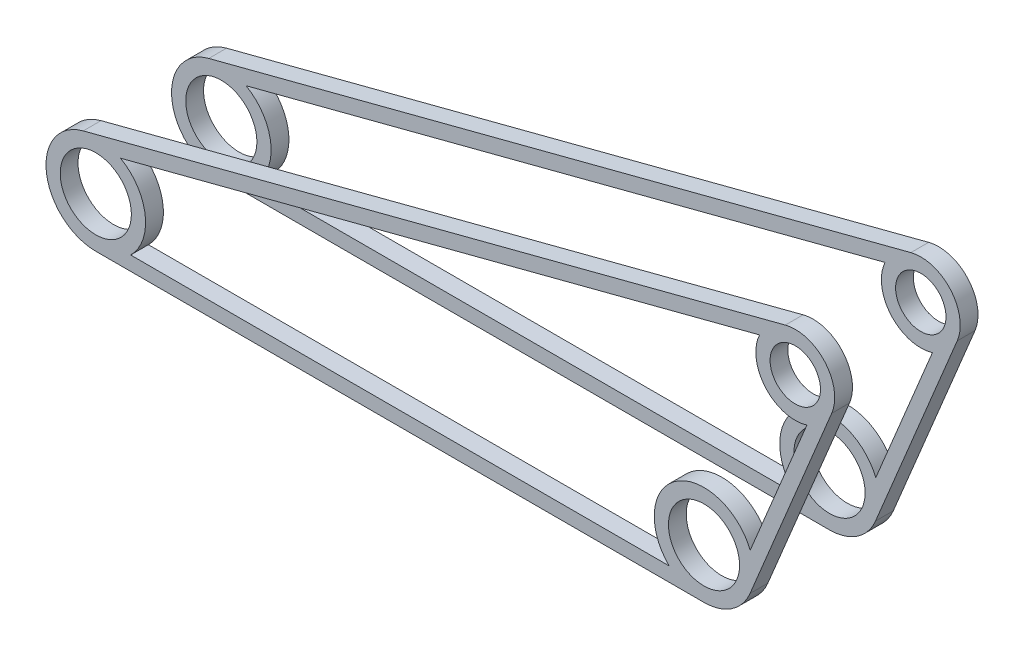
ISO-10303-21;
HEADER;
FILE_DESCRIPTION(('STEP AP214'),'2;1');
FILE_NAME('part.step','',(''),(''),'','','');
FILE_SCHEMA(('AUTOMOTIVE_DESIGN { 1 0 10303 214 1 1 1 1 }'));
ENDSEC;
DATA;
#1=APPLICATION_CONTEXT('core data for automotive mechanical design processes');
#2=APPLICATION_PROTOCOL_DEFINITION('international standard','automotive_design',2000,#1);
#3=PRODUCT_CONTEXT('',#1,'mechanical');
#4=PRODUCT('Part','Part','',(#3));
#5=PRODUCT_RELATED_PRODUCT_CATEGORY('part','',(#4));
#6=PRODUCT_DEFINITION_FORMATION('','',#4);
#7=PRODUCT_DEFINITION_CONTEXT('part definition',#1,'design');
#8=PRODUCT_DEFINITION('design','',#6,#7);
#9=PRODUCT_DEFINITION_SHAPE('','',#8);
#10=(LENGTH_UNIT() NAMED_UNIT(*) SI_UNIT(.MILLI.,.METRE.));
#11=(NAMED_UNIT(*) PLANE_ANGLE_UNIT() SI_UNIT($,.RADIAN.));
#12=(NAMED_UNIT(*) SI_UNIT($,.STERADIAN.) SOLID_ANGLE_UNIT());
#13=UNCERTAINTY_MEASURE_WITH_UNIT(LENGTH_MEASURE(1.E-05),#10,'distance_accuracy_value','');
#14=(GEOMETRIC_REPRESENTATION_CONTEXT(3) GLOBAL_UNCERTAINTY_ASSIGNED_CONTEXT((#13)) GLOBAL_UNIT_ASSIGNED_CONTEXT((#10,
#11,#12)) REPRESENTATION_CONTEXT('',''));
#15=CARTESIAN_POINT('',(0.,0.,0.));
#16=DIRECTION('',(0.,0.,1.));
#17=DIRECTION('',(1.,0.,0.));
#18=AXIS2_PLACEMENT_3D('',#15,#16,#17);
#19=CARTESIAN_POINT('',(108.585,0.,-12.79271));
#20=DIRECTION('',(0.,0.,1.));
#21=DIRECTION('',(1.,0.,0.));
#22=AXIS2_PLACEMENT_3D('',#19,#20,#21);
#23=CYLINDRICAL_SURFACE('',#22,8.88999999999992);
#24=CARTESIAN_POINT('',(108.585,0.,-9.61771));
#25=DIRECTION('',(0.,0.,1.));
#26=DIRECTION('',(1.,0.,0.));
#27=AXIS2_PLACEMENT_3D('',#24,#25,#26);
#28=CIRCLE('',#27,8.88999999999992);
#29=CARTESIAN_POINT('',(108.585,-8.88999999999996,-9.61771));
#30=VERTEX_POINT('',#29);
#31=CARTESIAN_POINT('',(116.796258377343,-3.40695404437924,-9.61771));
#32=VERTEX_POINT('',#31);
#33=EDGE_CURVE('E220',#30,#32,#28,.T.);
#34=ORIENTED_EDGE('',*,*,#33,.F.);
#35=DIRECTION('',(0.,0.,1.));
#36=VECTOR('',#35,1.);
#37=CARTESIAN_POINT('',(108.585,-8.88999999999996,-12.79271));
#38=LINE('',#37,#36);
#39=CARTESIAN_POINT('',(108.585,-8.88999999999996,-12.79271));
#40=VERTEX_POINT('',#39);
#41=EDGE_CURVE('E12',#40,#30,#38,.T.);
#42=ORIENTED_EDGE('',*,*,#41,.F.);
#43=CARTESIAN_POINT('',(108.585,0.,-12.79271));
#44=DIRECTION('',(0.,0.,1.));
#45=DIRECTION('',(1.,0.,0.));
#46=AXIS2_PLACEMENT_3D('',#43,#44,#45);
#47=CIRCLE('',#46,8.88999999999992);
#48=CARTESIAN_POINT('',(116.796258377343,-3.40695404437924,-12.79271));
#49=VERTEX_POINT('',#48);
#50=EDGE_CURVE('E342',#40,#49,#47,.T.);
#51=ORIENTED_EDGE('',*,*,#50,.T.);
#52=DIRECTION('',(0.,0.,1.));
#53=VECTOR('',#52,1.);
#54=CARTESIAN_POINT('',(116.796258377343,-3.40695404437924,-12.79271));
#55=LINE('',#54,#53);
#56=EDGE_CURVE('E252',#49,#32,#55,.T.);
#57=ORIENTED_EDGE('',*,*,#56,.T.);
#58=EDGE_LOOP('',(#34,#42,#51,#57));
#59=FACE_BOUND('',#58,.T.);
#60=ADVANCED_FACE('F57',(#59),#23,.T.);
#61=CARTESIAN_POINT('',(0.,-8.89,-12.79271));
#62=DIRECTION('',(0.,1.,0.));
#63=DIRECTION('',(0.,0.,1.));
#64=AXIS2_PLACEMENT_3D('',#61,#62,#63);
#65=PLANE('',#64);
#66=DIRECTION('',(-1.,0.,0.));
#67=VECTOR('',#66,1.);
#68=CARTESIAN_POINT('',(0.,-8.89,-9.61771));
#69=LINE('',#68,#67);
#70=CARTESIAN_POINT('',(0.,-8.89,-9.61771));
#71=VERTEX_POINT('',#70);
#72=EDGE_CURVE('E237',#30,#71,#69,.T.);
#73=ORIENTED_EDGE('',*,*,#72,.T.);
#74=DIRECTION('',(0.,0.,1.));
#75=VECTOR('',#74,1.);
#76=CARTESIAN_POINT('',(0.,-8.89,-12.79271));
#77=LINE('',#76,#75);
#78=CARTESIAN_POINT('',(0.,-8.89,-12.79271));
#79=VERTEX_POINT('',#78);
#80=EDGE_CURVE('E68',#79,#71,#77,.T.);
#81=ORIENTED_EDGE('',*,*,#80,.F.);
#82=DIRECTION('',(-1.,0.,0.));
#83=VECTOR('',#82,1.);
#84=CARTESIAN_POINT('',(0.,-8.89,-12.79271));
#85=LINE('',#84,#83);
#86=EDGE_CURVE('E177',#40,#79,#85,.T.);
#87=ORIENTED_EDGE('',*,*,#86,.F.);
#88=ORIENTED_EDGE('',*,*,#41,.T.);
#89=EDGE_LOOP('',(#73,#81,#87,#88));
#90=FACE_BOUND('',#89,.T.);
#91=ADVANCED_FACE('F296',(#90),#65,.F.);
#92=CARTESIAN_POINT('',(0.,0.,-12.79271));
#93=DIRECTION('',(0.,0.,1.));
#94=DIRECTION('',(1.,0.,0.));
#95=AXIS2_PLACEMENT_3D('',#92,#93,#94);
#96=CYLINDRICAL_SURFACE('',#95,8.89);
#97=CARTESIAN_POINT('',(0.,0.,-9.61771));
#98=DIRECTION('',(0.,0.,1.));
#99=DIRECTION('',(1.,0.,0.));
#100=AXIS2_PLACEMENT_3D('',#97,#98,#99);
#101=CIRCLE('',#100,8.89);
#102=CARTESIAN_POINT('',(-2.24093910567499,8.60292345221417,-9.61771));
#103=VERTEX_POINT('',#102);
#104=EDGE_CURVE('E158',#103,#71,#101,.T.);
#105=ORIENTED_EDGE('',*,*,#104,.F.);
#106=DIRECTION('',(0.,0.,1.));
#107=VECTOR('',#106,1.);
#108=CARTESIAN_POINT('',(-2.24093910567499,8.60292345221417,-12.79271));
#109=LINE('',#108,#107);
#110=CARTESIAN_POINT('',(-2.24093910567499,8.60292345221417,-12.79271));
#111=VERTEX_POINT('',#110);
#112=EDGE_CURVE('E152',#111,#103,#109,.T.);
#113=ORIENTED_EDGE('',*,*,#112,.F.);
#114=CARTESIAN_POINT('',(0.,0.,-12.79271));
#115=DIRECTION('',(0.,0.,1.));
#116=DIRECTION('',(1.,0.,0.));
#117=AXIS2_PLACEMENT_3D('',#114,#115,#116);
#118=CIRCLE('',#117,8.89);
#119=EDGE_CURVE('E156',#111,#79,#118,.T.);
#120=ORIENTED_EDGE('',*,*,#119,.T.);
#121=ORIENTED_EDGE('',*,*,#80,.T.);
#122=EDGE_LOOP('',(#105,#113,#120,#121));
#123=FACE_BOUND('',#122,.T.);
#124=ADVANCED_FACE('F154',(#123),#96,.T.);
#125=CARTESIAN_POINT('',(-2.24093910567499,8.60292345221417,-12.79271));
#126=DIRECTION('',(0.252074140120921,-0.967707924883484,0.));
#127=DIRECTION('',(0.967707924883484,0.252074140120921,0.));
#128=AXIS2_PLACEMENT_3D('',#125,#126,#127);
#129=PLANE('',#128);
#130=DIRECTION('',(0.967707924883484,0.252074140120921,0.));
#131=VECTOR('',#130,1.);
#132=CARTESIAN_POINT('',(-2.24093910567499,8.60292345221417,-9.61771));
#133=LINE('',#132,#131);
#134=CARTESIAN_POINT('',(123.103161211443,41.253277442518,-9.61771));
#135=VERTEX_POINT('',#134);
#136=EDGE_CURVE('E232',#103,#135,#133,.T.);
#137=ORIENTED_EDGE('',*,*,#136,.T.);
#138=DIRECTION('',(0.,0.,1.));
#139=VECTOR('',#138,1.);
#140=CARTESIAN_POINT('',(123.103161211443,41.253277442518,-12.79271));
#141=LINE('',#140,#139);
#142=CARTESIAN_POINT('',(123.103161211443,41.253277442518,-12.79271));
#143=VERTEX_POINT('',#142);
#144=EDGE_CURVE('E163',#143,#135,#141,.T.);
#145=ORIENTED_EDGE('',*,*,#144,.F.);
#146=DIRECTION('',(0.967707924883484,0.252074140120921,0.));
#147=VECTOR('',#146,1.);
#148=CARTESIAN_POINT('',(-2.24093910567499,8.60292345221417,-12.79271));
#149=LINE('',#148,#147);
#150=EDGE_CURVE('E166',#111,#143,#149,.T.);
#151=ORIENTED_EDGE('',*,*,#150,.F.);
#152=ORIENTED_EDGE('',*,*,#112,.T.);
#153=EDGE_LOOP('',(#137,#145,#151,#152));
#154=FACE_BOUND('',#153,.T.);
#155=ADVANCED_FACE('F167',(#154),#129,.F.);
#156=CARTESIAN_POINT('',(124.877763157895,34.4406136513383,-12.79271));
#157=DIRECTION('',(0.,0.,1.));
#158=DIRECTION('',(1.,0.,0.));
#159=AXIS2_PLACEMENT_3D('',#156,#157,#158);
#160=CYLINDRICAL_SURFACE('',#159,7.04000000000003);
#161=CARTESIAN_POINT('',(124.877763157895,34.4406136513383,-9.61771));
#162=DIRECTION('',(0.,0.,1.));
#163=DIRECTION('',(1.,0.,0.));
#164=AXIS2_PLACEMENT_3D('',#161,#162,#163);
#165=CIRCLE('',#164,7.04000000000003);
#166=CARTESIAN_POINT('',(131.380266979773,31.7426432944845,-9.61771));
#167=VERTEX_POINT('',#166);
#168=EDGE_CURVE('E228',#167,#135,#165,.T.);
#169=ORIENTED_EDGE('',*,*,#168,.F.);
#170=DIRECTION('',(0.,0.,1.));
#171=VECTOR('',#170,1.);
#172=CARTESIAN_POINT('',(131.380266979773,31.7426432944845,-12.79271));
#173=LINE('',#172,#171);
#174=CARTESIAN_POINT('',(131.380266979773,31.7426432944845,-12.79271));
#175=VERTEX_POINT('',#174);
#176=EDGE_CURVE('E249',#175,#167,#173,.T.);
#177=ORIENTED_EDGE('',*,*,#176,.F.);
#178=CARTESIAN_POINT('',(124.877763157895,34.4406136513383,-12.79271));
#179=DIRECTION('',(0.,0.,1.));
#180=DIRECTION('',(1.,0.,0.));
#181=AXIS2_PLACEMENT_3D('',#178,#179,#180);
#182=CIRCLE('',#181,7.04000000000003);
#183=EDGE_CURVE('E172',#175,#143,#182,.T.);
#184=ORIENTED_EDGE('',*,*,#183,.T.);
#185=ORIENTED_EDGE('',*,*,#144,.T.);
#186=EDGE_LOOP('',(#169,#177,#184,#185));
#187=FACE_BOUND('',#186,.T.);
#188=ADVANCED_FACE('F354',(#187),#160,.T.);
#189=CARTESIAN_POINT('',(98.5024549059795,-40.8699034546516,-12.79271));
#190=DIRECTION('',(0.923651111062219,-0.383234425689456,0.));
#191=DIRECTION('',(0.383234425689456,0.923651111062219,0.));
#192=AXIS2_PLACEMENT_3D('',#189,#190,#191);
#193=PLANE('',#192);
#194=DIRECTION('',(0.383234425689456,0.923651111062219,0.));
#195=VECTOR('',#194,1.);
#196=CARTESIAN_POINT('',(98.5024549059795,-40.8699034546516,-9.61771));
#197=LINE('',#196,#195);
#198=CARTESIAN_POINT('',(116.834555694057,3.31314515991316,-9.61771));
#199=VERTEX_POINT('',#198);
#200=CARTESIAN_POINT('',(126.959354756851,27.7153942188472,-9.61771));
#201=VERTEX_POINT('',#200);
#202=EDGE_CURVE('E192',#199,#201,#197,.T.);
#203=ORIENTED_EDGE('',*,*,#202,.T.);
#204=DIRECTION('',(0.,0.,1.));
#205=VECTOR('',#204,1.);
#206=CARTESIAN_POINT('',(126.959354756851,27.7153942188472,-12.79271));
#207=LINE('',#206,#205);
#208=CARTESIAN_POINT('',(126.959354756851,27.7153942188472,-12.79271));
#209=VERTEX_POINT('',#208);
#210=EDGE_CURVE('E255',#209,#201,#207,.T.);
#211=ORIENTED_EDGE('',*,*,#210,.F.);
#212=DIRECTION('',(0.383234425689456,0.923651111062219,0.));
#213=VECTOR('',#212,1.);
#214=CARTESIAN_POINT('',(98.5024549059795,-40.8699034546516,-12.79271));
#215=LINE('',#214,#213);
#216=CARTESIAN_POINT('',(116.834555694057,3.31314515991316,-12.79271));
#217=VERTEX_POINT('',#216);
#218=EDGE_CURVE('E274',#217,#209,#215,.T.);
#219=ORIENTED_EDGE('',*,*,#218,.F.);
#220=DIRECTION('',(0.,0.,1.));
#221=VECTOR('',#220,1.);
#222=CARTESIAN_POINT('',(116.834555694057,3.31314515991316,-12.79271));
#223=LINE('',#222,#221);
#224=EDGE_CURVE('E61',#217,#199,#223,.T.);
#225=ORIENTED_EDGE('',*,*,#224,.T.);
#226=EDGE_LOOP('',(#203,#211,#219,#225));
#227=FACE_BOUND('',#226,.T.);
#228=ADVANCED_FACE('F272',(#227),#193,.F.);
#229=CARTESIAN_POINT('',(124.877763157895,34.4406136513383,-12.79271));
#230=DIRECTION('',(0.,0.,1.));
#231=DIRECTION('',(1.,0.,0.));
#232=AXIS2_PLACEMENT_3D('',#229,#230,#231);
#233=CYLINDRICAL_SURFACE('',#232,7.04000000000003);
#234=CARTESIAN_POINT('',(124.877763157895,34.4406136513383,-9.61771));
#235=DIRECTION('',(0.,0.,1.));
#236=DIRECTION('',(1.,0.,0.));
#237=AXIS2_PLACEMENT_3D('',#234,#235,#236);
#238=CIRCLE('',#237,7.04000000000003);
#239=CARTESIAN_POINT('',(118.504240590403,37.4305651696196,-9.61771));
#240=VERTEX_POINT('',#239);
#241=EDGE_CURVE('E212',#240,#201,#238,.T.);
#242=ORIENTED_EDGE('',*,*,#241,.F.);
#243=DIRECTION('',(0.,0.,1.));
#244=VECTOR('',#243,1.);
#245=CARTESIAN_POINT('',(118.504240590403,37.4305651696196,-12.79271));
#246=LINE('',#245,#244);
#247=CARTESIAN_POINT('',(118.504240590403,37.4305651696196,-12.79271));
#248=VERTEX_POINT('',#247);
#249=EDGE_CURVE('E258',#248,#240,#246,.T.);
#250=ORIENTED_EDGE('',*,*,#249,.F.);
#251=CARTESIAN_POINT('',(124.877763157895,34.4406136513383,-12.79271));
#252=DIRECTION('',(0.,0.,1.));
#253=DIRECTION('',(1.,0.,0.));
#254=AXIS2_PLACEMENT_3D('',#251,#252,#253);
#255=CIRCLE('',#254,7.04000000000003);
#256=EDGE_CURVE('E333',#248,#209,#255,.T.);
#257=ORIENTED_EDGE('',*,*,#256,.T.);
#258=ORIENTED_EDGE('',*,*,#210,.T.);
#259=EDGE_LOOP('',(#242,#250,#257,#258));
#260=FACE_BOUND('',#259,.T.);
#261=ADVANCED_FACE('F305',(#260),#233,.T.);
#262=CARTESIAN_POINT('',(-1.60067078976785,6.14494532301012,-12.79271));
#263=DIRECTION('',(0.252074140120921,-0.967707924883484,0.));
#264=DIRECTION('',(0.967707924883484,0.252074140120921,0.));
#265=AXIS2_PLACEMENT_3D('',#262,#263,#264);
#266=PLANE('',#265);
#267=DIRECTION('',(0.967707924883484,0.252074140120921,0.));
#268=VECTOR('',#267,1.);
#269=CARTESIAN_POINT('',(-1.60067078976785,6.14494532301012,-9.61771));
#270=LINE('',#269,#268);
#271=CARTESIAN_POINT('',(4.42012142570285,7.71327599545372,-9.61771));
#272=VERTEX_POINT('',#271);
#273=EDGE_CURVE('E208',#272,#240,#270,.T.);
#274=ORIENTED_EDGE('',*,*,#273,.F.);
#275=DIRECTION('',(0.,0.,1.));
#276=VECTOR('',#275,1.);
#277=CARTESIAN_POINT('',(4.42012142570285,7.71327599545372,-12.79271));
#278=LINE('',#277,#276);
#279=CARTESIAN_POINT('',(4.42012142570285,7.71327599545372,-12.79271));
#280=VERTEX_POINT('',#279);
#281=EDGE_CURVE('E261',#280,#272,#278,.T.);
#282=ORIENTED_EDGE('',*,*,#281,.F.);
#283=DIRECTION('',(0.967707924883484,0.252074140120921,0.));
#284=VECTOR('',#283,1.);
#285=CARTESIAN_POINT('',(-1.60067078976785,6.14494532301012,-12.79271));
#286=LINE('',#285,#284);
#287=EDGE_CURVE('E337',#280,#248,#286,.T.);
#288=ORIENTED_EDGE('',*,*,#287,.T.);
#289=ORIENTED_EDGE('',*,*,#249,.T.);
#290=EDGE_LOOP('',(#274,#282,#288,#289));
#291=FACE_BOUND('',#290,.T.);
#292=ADVANCED_FACE('F308',(#291),#266,.T.);
#293=CARTESIAN_POINT('',(0.,0.,-12.79271));
#294=DIRECTION('',(0.,0.,1.));
#295=DIRECTION('',(1.,0.,0.));
#296=AXIS2_PLACEMENT_3D('',#293,#294,#295);
#297=CYLINDRICAL_SURFACE('',#296,8.89);
#298=CARTESIAN_POINT('',(0.,0.,-9.61771));
#299=DIRECTION('',(0.,0.,1.));
#300=DIRECTION('',(1.,0.,0.));
#301=AXIS2_PLACEMENT_3D('',#298,#299,#300);
#302=CIRCLE('',#301,8.89);
#303=CARTESIAN_POINT('',(6.22170394666927,-6.35,-9.61771));
#304=VERTEX_POINT('',#303);
#305=EDGE_CURVE('E204',#304,#272,#302,.T.);
#306=ORIENTED_EDGE('',*,*,#305,.F.);
#307=DIRECTION('',(0.,0.,1.));
#308=VECTOR('',#307,1.);
#309=CARTESIAN_POINT('',(6.22170394666927,-6.35,-12.79271));
#310=LINE('',#309,#308);
#311=CARTESIAN_POINT('',(6.22170394666927,-6.35,-12.79271));
#312=VERTEX_POINT('',#311);
#313=EDGE_CURVE('E264',#312,#304,#310,.T.);
#314=ORIENTED_EDGE('',*,*,#313,.F.);
#315=CARTESIAN_POINT('',(0.,0.,-12.79271));
#316=DIRECTION('',(0.,0.,1.));
#317=DIRECTION('',(1.,0.,0.));
#318=AXIS2_PLACEMENT_3D('',#315,#316,#317);
#319=CIRCLE('',#318,8.89);
#320=EDGE_CURVE('E328',#312,#280,#319,.T.);
#321=ORIENTED_EDGE('',*,*,#320,.T.);
#322=ORIENTED_EDGE('',*,*,#281,.T.);
#323=EDGE_LOOP('',(#306,#314,#321,#322));
#324=FACE_BOUND('',#323,.T.);
#325=ADVANCED_FACE('F312',(#324),#297,.T.);
#326=CARTESIAN_POINT('',(0.,-6.35,-12.79271));
#327=DIRECTION('',(0.,-1.,0.));
#328=DIRECTION('',(1.,0.,0.));
#329=AXIS2_PLACEMENT_3D('',#326,#327,#328);
#330=PLANE('',#329);
#331=DIRECTION('',(1.,0.,0.));
#332=VECTOR('',#331,1.);
#333=CARTESIAN_POINT('',(0.,-6.35,-9.61771));
#334=LINE('',#333,#332);
#335=CARTESIAN_POINT('',(102.363296053331,-6.35,-9.61771));
#336=VERTEX_POINT('',#335);
#337=EDGE_CURVE('E200',#304,#336,#334,.T.);
#338=ORIENTED_EDGE('',*,*,#337,.T.);
#339=DIRECTION('',(0.,0.,1.));
#340=VECTOR('',#339,1.);
#341=CARTESIAN_POINT('',(102.363296053331,-6.35,-12.79271));
#342=LINE('',#341,#340);
#343=CARTESIAN_POINT('',(102.363296053331,-6.35,-12.79271));
#344=VERTEX_POINT('',#343);
#345=EDGE_CURVE('E266',#344,#336,#342,.T.);
#346=ORIENTED_EDGE('',*,*,#345,.F.);
#347=DIRECTION('',(1.,0.,0.));
#348=VECTOR('',#347,1.);
#349=CARTESIAN_POINT('',(0.,-6.35,-12.79271));
#350=LINE('',#349,#348);
#351=EDGE_CURVE('E533',#312,#344,#350,.T.);
#352=ORIENTED_EDGE('',*,*,#351,.F.);
#353=ORIENTED_EDGE('',*,*,#313,.T.);
#354=EDGE_LOOP('',(#338,#346,#352,#353));
#355=FACE_BOUND('',#354,.T.);
#356=ADVANCED_FACE('F315',(#355),#330,.F.);
#357=CARTESIAN_POINT('',(100.848528728078,-41.8433188959028,-12.79271));
#358=DIRECTION('',(-0.92365111106222,0.383234425689455,0.));
#359=DIRECTION('',(-0.383234425689455,-0.92365111106222,0.));
#360=AXIS2_PLACEMENT_3D('',#357,#358,#359);
#361=PLANE('',#360);
#362=DIRECTION('',(-0.383234425689455,-0.92365111106222,0.));
#363=VECTOR('',#362,1.);
#364=CARTESIAN_POINT('',(100.848528728078,-41.8433188959028,-9.61771));
#365=LINE('',#364,#363);
#366=EDGE_CURVE('E224',#167,#32,#365,.T.);
#367=ORIENTED_EDGE('',*,*,#366,.T.);
#368=ORIENTED_EDGE('',*,*,#56,.F.);
#369=DIRECTION('',(-0.383234425689455,-0.92365111106222,0.));
#370=VECTOR('',#369,1.);
#371=CARTESIAN_POINT('',(100.848528728078,-41.8433188959028,-12.79271));
#372=LINE('',#371,#370);
#373=EDGE_CURVE('E349',#175,#49,#372,.T.);
#374=ORIENTED_EDGE('',*,*,#373,.F.);
#375=ORIENTED_EDGE('',*,*,#176,.T.);
#376=EDGE_LOOP('',(#367,#368,#374,#375));
#377=FACE_BOUND('',#376,.T.);
#378=ADVANCED_FACE('F291',(#377),#361,.F.);
#379=CARTESIAN_POINT('',(124.877763157895,34.4406136513383,-12.79271));
#380=DIRECTION('',(0.,0.,1.));
#381=DIRECTION('',(1.,0.,0.));
#382=AXIS2_PLACEMENT_3D('',#379,#380,#381);
#383=CYLINDRICAL_SURFACE('',#382,4.50000000000002);
#384=CARTESIAN_POINT('',(124.877763157895,34.4406136513383,-12.79271));
#385=DIRECTION('',(0.,0.,1.));
#386=DIRECTION('',(1.,0.,0.));
#387=AXIS2_PLACEMENT_3D('',#384,#385,#386);
#388=CIRCLE('',#387,4.50000000000002);
#389=CARTESIAN_POINT('',(129.377763157895,34.4406136513383,-12.79271));
#390=VERTEX_POINT('',#389);
#391=EDGE_CURVE('E336',#390,#390,#388,.T.);
#392=ORIENTED_EDGE('',*,*,#391,.F.);
#393=EDGE_LOOP('',(#392));
#394=FACE_BOUND('',#393,.T.);
#395=CARTESIAN_POINT('',(124.877763157895,34.4406136513383,-9.61771));
#396=DIRECTION('',(0.,0.,1.));
#397=DIRECTION('',(1.,0.,0.));
#398=AXIS2_PLACEMENT_3D('',#395,#396,#397);
#399=CIRCLE('',#398,4.50000000000002);
#400=CARTESIAN_POINT('',(129.377763157895,34.4406136513383,-9.61771));
#401=VERTEX_POINT('',#400);
#402=EDGE_CURVE('E216',#401,#401,#399,.T.);
#403=ORIENTED_EDGE('',*,*,#402,.T.);
#404=EDGE_LOOP('',(#403));
#405=FACE_BOUND('',#404,.T.);
#406=ADVANCED_FACE('F283',(#394,#405),#383,.F.);
#407=CARTESIAN_POINT('',(108.585,0.,-12.79271));
#408=DIRECTION('',(0.,0.,1.));
#409=DIRECTION('',(1.,0.,0.));
#410=AXIS2_PLACEMENT_3D('',#407,#408,#409);
#411=CYLINDRICAL_SURFACE('',#410,8.88999999999992);
#412=CARTESIAN_POINT('',(108.585,0.,-9.61771));
#413=DIRECTION('',(0.,0.,1.));
#414=DIRECTION('',(1.,0.,0.));
#415=AXIS2_PLACEMENT_3D('',#412,#413,#414);
#416=CIRCLE('',#415,8.88999999999992);
#417=EDGE_CURVE('E196',#199,#336,#416,.T.);
#418=ORIENTED_EDGE('',*,*,#417,.F.);
#419=ORIENTED_EDGE('',*,*,#224,.F.);
#420=CARTESIAN_POINT('',(108.585,0.,-12.79271));
#421=DIRECTION('',(0.,0.,1.));
#422=DIRECTION('',(1.,0.,0.));
#423=AXIS2_PLACEMENT_3D('',#420,#421,#422);
#424=CIRCLE('',#423,8.88999999999992);
#425=EDGE_CURVE('E528',#217,#344,#424,.T.);
#426=ORIENTED_EDGE('',*,*,#425,.T.);
#427=ORIENTED_EDGE('',*,*,#345,.T.);
#428=EDGE_LOOP('',(#418,#419,#426,#427));
#429=FACE_BOUND('',#428,.T.);
#430=ADVANCED_FACE('F281',(#429),#411,.T.);
#431=CARTESIAN_POINT('',(108.585,0.,-12.79271));
#432=DIRECTION('',(0.,0.,1.));
#433=DIRECTION('',(1.,0.,0.));
#434=AXIS2_PLACEMENT_3D('',#431,#432,#433);
#435=CYLINDRICAL_SURFACE('',#434,6.35000000000007);
#436=CARTESIAN_POINT('',(108.585,0.,-12.79271));
#437=DIRECTION('',(0.,0.,1.));
#438=DIRECTION('',(1.,0.,0.));
#439=AXIS2_PLACEMENT_3D('',#436,#437,#438);
#440=CIRCLE('',#439,6.35000000000007);
#441=CARTESIAN_POINT('',(114.935,0.,-12.79271));
#442=VERTEX_POINT('',#441);
#443=EDGE_CURVE('E243',#442,#442,#440,.T.);
#444=ORIENTED_EDGE('',*,*,#443,.F.);
#445=EDGE_LOOP('',(#444));
#446=FACE_BOUND('',#445,.T.);
#447=CARTESIAN_POINT('',(108.585,0.,-9.61771));
#448=DIRECTION('',(0.,0.,1.));
#449=DIRECTION('',(1.,0.,0.));
#450=AXIS2_PLACEMENT_3D('',#447,#448,#449);
#451=CIRCLE('',#450,6.35000000000007);
#452=CARTESIAN_POINT('',(114.935,0.,-9.61771));
#453=VERTEX_POINT('',#452);
#454=EDGE_CURVE('E188',#453,#453,#451,.T.);
#455=ORIENTED_EDGE('',*,*,#454,.T.);
#456=EDGE_LOOP('',(#455));
#457=FACE_BOUND('',#456,.T.);
#458=ADVANCED_FACE('F59',(#446,#457),#435,.F.);
#459=CARTESIAN_POINT('',(0.,0.,-12.79271));
#460=DIRECTION('',(0.,0.,1.));
#461=DIRECTION('',(1.,0.,0.));
#462=AXIS2_PLACEMENT_3D('',#459,#460,#461);
#463=CYLINDRICAL_SURFACE('',#462,6.35);
#464=CARTESIAN_POINT('',(0.,0.,-12.79271));
#465=DIRECTION('',(0.,0.,1.));
#466=DIRECTION('',(1.,0.,0.));
#467=AXIS2_PLACEMENT_3D('',#464,#465,#466);
#468=CIRCLE('',#467,6.35);
#469=CARTESIAN_POINT('',(6.35,0.,-12.79271));
#470=VERTEX_POINT('',#469);
#471=EDGE_CURVE('E181',#470,#470,#468,.T.);
#472=ORIENTED_EDGE('',*,*,#471,.F.);
#473=EDGE_LOOP('',(#472));
#474=FACE_BOUND('',#473,.T.);
#475=CARTESIAN_POINT('',(0.,0.,-9.61771));
#476=DIRECTION('',(0.,0.,1.));
#477=DIRECTION('',(1.,0.,0.));
#478=AXIS2_PLACEMENT_3D('',#475,#476,#477);
#479=CIRCLE('',#478,6.35);
#480=CARTESIAN_POINT('',(6.35,0.,-9.61771));
#481=VERTEX_POINT('',#480);
#482=EDGE_CURVE('E240',#481,#481,#479,.T.);
#483=ORIENTED_EDGE('',*,*,#482,.T.);
#484=EDGE_LOOP('',(#483));
#485=FACE_BOUND('',#484,.T.);
#486=ADVANCED_FACE('F289',(#474,#485),#463,.F.);
#487=CARTESIAN_POINT('',(0.,0.,-12.79271));
#488=DIRECTION('',(0.,0.,1.));
#489=DIRECTION('',(1.,0.,0.));
#490=AXIS2_PLACEMENT_3D('',#487,#488,#489);
#491=PLANE('',#490);
#492=ORIENTED_EDGE('',*,*,#443,.T.);
#493=EDGE_LOOP('',(#492));
#494=FACE_BOUND('',#493,.T.);
#495=ORIENTED_EDGE('',*,*,#218,.T.);
#496=ORIENTED_EDGE('',*,*,#256,.F.);
#497=ORIENTED_EDGE('',*,*,#287,.F.);
#498=ORIENTED_EDGE('',*,*,#320,.F.);
#499=ORIENTED_EDGE('',*,*,#351,.T.);
#500=ORIENTED_EDGE('',*,*,#425,.F.);
#501=EDGE_LOOP('',(#495,#496,#497,#498,#499,#500));
#502=FACE_BOUND('',#501,.T.);
#503=ORIENTED_EDGE('',*,*,#391,.T.);
#504=EDGE_LOOP('',(#503));
#505=FACE_BOUND('',#504,.T.);
#506=ORIENTED_EDGE('',*,*,#50,.F.);
#507=ORIENTED_EDGE('',*,*,#86,.T.);
#508=ORIENTED_EDGE('',*,*,#119,.F.);
#509=ORIENTED_EDGE('',*,*,#150,.T.);
#510=ORIENTED_EDGE('',*,*,#183,.F.);
#511=ORIENTED_EDGE('',*,*,#373,.T.);
#512=EDGE_LOOP('',(#506,#507,#508,#509,#510,#511));
#513=FACE_BOUND('',#512,.T.);
#514=ORIENTED_EDGE('',*,*,#471,.T.);
#515=EDGE_LOOP('',(#514));
#516=FACE_BOUND('',#515,.T.);
#517=ADVANCED_FACE('F175',(#494,#502,#505,#513,#516),#491,.F.);
#518=CARTESIAN_POINT('',(0.,0.,-9.61771));
#519=DIRECTION('',(0.,0.,1.));
#520=DIRECTION('',(1.,0.,0.));
#521=AXIS2_PLACEMENT_3D('',#518,#519,#520);
#522=PLANE('',#521);
#523=ORIENTED_EDGE('',*,*,#454,.F.);
#524=EDGE_LOOP('',(#523));
#525=FACE_BOUND('',#524,.T.);
#526=ORIENTED_EDGE('',*,*,#202,.F.);
#527=ORIENTED_EDGE('',*,*,#417,.T.);
#528=ORIENTED_EDGE('',*,*,#337,.F.);
#529=ORIENTED_EDGE('',*,*,#305,.T.);
#530=ORIENTED_EDGE('',*,*,#273,.T.);
#531=ORIENTED_EDGE('',*,*,#241,.T.);
#532=EDGE_LOOP('',(#526,#527,#528,#529,#530,#531));
#533=FACE_BOUND('',#532,.T.);
#534=ORIENTED_EDGE('',*,*,#402,.F.);
#535=EDGE_LOOP('',(#534));
#536=FACE_BOUND('',#535,.T.);
#537=ORIENTED_EDGE('',*,*,#33,.T.);
#538=ORIENTED_EDGE('',*,*,#366,.F.);
#539=ORIENTED_EDGE('',*,*,#168,.T.);
#540=ORIENTED_EDGE('',*,*,#136,.F.);
#541=ORIENTED_EDGE('',*,*,#104,.T.);
#542=ORIENTED_EDGE('',*,*,#72,.F.);
#543=EDGE_LOOP('',(#537,#538,#539,#540,#541,#542));
#544=FACE_BOUND('',#543,.T.);
#545=ORIENTED_EDGE('',*,*,#482,.F.);
#546=EDGE_LOOP('',(#545));
#547=FACE_BOUND('',#546,.T.);
#548=ADVANCED_FACE('F277',(#525,#533,#536,#544,#547),#522,.T.);
#549=CLOSED_SHELL('',(#60,#91,#124,#155,#188,#228,#261,#292,#325,#356,#378,#406,#430,#458,#486,
#517,#548));
#550=MANIFOLD_SOLID_BREP('B2',#549);
#551=CARTESIAN_POINT('',(108.585,0.,12.79271));
#552=DIRECTION('',(0.,0.,-1.));
#553=DIRECTION('',(-1.,0.,0.));
#554=AXIS2_PLACEMENT_3D('',#551,#552,#553);
#555=CYLINDRICAL_SURFACE('',#554,8.88999999999992);
#556=CARTESIAN_POINT('',(108.585,0.,9.61771));
#557=DIRECTION('',(0.,0.,1.));
#558=DIRECTION('',(1.,0.,0.));
#559=AXIS2_PLACEMENT_3D('',#556,#557,#558);
#560=CIRCLE('',#559,8.88999999999992);
#561=CARTESIAN_POINT('',(108.585,-8.88999999999996,9.61771));
#562=VERTEX_POINT('',#561);
#563=CARTESIAN_POINT('',(116.796258377343,-3.40695404437924,9.61771));
#564=VERTEX_POINT('',#563);
#565=EDGE_CURVE('E698',#562,#564,#560,.T.);
#566=ORIENTED_EDGE('',*,*,#565,.T.);
#567=DIRECTION('',(0.,0.,-1.));
#568=VECTOR('',#567,1.);
#569=CARTESIAN_POINT('',(116.796258377343,-3.40695404437924,12.79271));
#570=LINE('',#569,#568);
#571=CARTESIAN_POINT('',(116.796258377343,-3.40695404437924,12.79271));
#572=VERTEX_POINT('',#571);
#573=EDGE_CURVE('E55',#572,#564,#570,.T.);
#574=ORIENTED_EDGE('',*,*,#573,.F.);
#575=CARTESIAN_POINT('',(108.585,0.,12.79271));
#576=DIRECTION('',(0.,0.,1.));
#577=DIRECTION('',(1.,0.,0.));
#578=AXIS2_PLACEMENT_3D('',#575,#576,#577);
#579=CIRCLE('',#578,8.88999999999992);
#580=CARTESIAN_POINT('',(108.585,-8.88999999999996,12.79271));
#581=VERTEX_POINT('',#580);
#582=EDGE_CURVE('E773',#581,#572,#579,.T.);
#583=ORIENTED_EDGE('',*,*,#582,.F.);
#584=DIRECTION('',(0.,0.,-1.));
#585=VECTOR('',#584,1.);
#586=CARTESIAN_POINT('',(108.585,-8.88999999999996,12.79271));
#587=LINE('',#586,#585);
#588=EDGE_CURVE('E563',#581,#562,#587,.T.);
#589=ORIENTED_EDGE('',*,*,#588,.T.);
#590=EDGE_LOOP('',(#566,#574,#583,#589));
#591=FACE_BOUND('',#590,.T.);
#592=ADVANCED_FACE('F544',(#591),#555,.T.);
#593=CARTESIAN_POINT('',(100.848528728078,-41.8433188959028,12.79271));
#594=DIRECTION('',(0.92365111106222,-0.383234425689455,0.));
#595=DIRECTION('',(0.383234425689455,0.92365111106222,0.));
#596=AXIS2_PLACEMENT_3D('',#593,#594,#595);
#597=PLANE('',#596);
#598=DIRECTION('',(-0.383234425689455,-0.92365111106222,0.));
#599=VECTOR('',#598,1.);
#600=CARTESIAN_POINT('',(100.848528728078,-41.8433188959028,9.61771));
#601=LINE('',#600,#599);
#602=CARTESIAN_POINT('',(131.380266979773,31.7426432944845,9.61771));
#603=VERTEX_POINT('',#602);
#604=EDGE_CURVE('E700',#603,#564,#601,.T.);
#605=ORIENTED_EDGE('',*,*,#604,.F.);
#606=DIRECTION('',(0.,0.,-1.));
#607=VECTOR('',#606,1.);
#608=CARTESIAN_POINT('',(131.380266979773,31.7426432944845,12.79271));
#609=LINE('',#608,#607);
#610=CARTESIAN_POINT('',(131.380266979773,31.7426432944845,12.79271));
#611=VERTEX_POINT('',#610);
#612=EDGE_CURVE('E554',#611,#603,#609,.T.);
#613=ORIENTED_EDGE('',*,*,#612,.F.);
#614=DIRECTION('',(-0.383234425689455,-0.92365111106222,0.));
#615=VECTOR('',#614,1.);
#616=CARTESIAN_POINT('',(100.848528728078,-41.8433188959028,12.79271));
#617=LINE('',#616,#615);
#618=EDGE_CURVE('E665',#611,#572,#617,.T.);
#619=ORIENTED_EDGE('',*,*,#618,.T.);
#620=ORIENTED_EDGE('',*,*,#573,.T.);
#621=EDGE_LOOP('',(#605,#613,#619,#620));
#622=FACE_BOUND('',#621,.T.);
#623=ADVANCED_FACE('F777',(#622),#597,.T.);
#624=CARTESIAN_POINT('',(124.877763157895,34.4406136513383,12.79271));
#625=DIRECTION('',(0.,0.,-1.));
#626=DIRECTION('',(-1.,0.,0.));
#627=AXIS2_PLACEMENT_3D('',#624,#625,#626);
#628=CYLINDRICAL_SURFACE('',#627,7.04000000000003);
#629=CARTESIAN_POINT('',(124.877763157895,34.4406136513383,9.61771));
#630=DIRECTION('',(0.,0.,1.));
#631=DIRECTION('',(1.,0.,0.));
#632=AXIS2_PLACEMENT_3D('',#629,#630,#631);
#633=CIRCLE('',#632,7.04000000000003);
#634=CARTESIAN_POINT('',(123.103161211443,41.253277442518,9.61771));
#635=VERTEX_POINT('',#634);
#636=EDGE_CURVE('E703',#603,#635,#633,.T.);
#637=ORIENTED_EDGE('',*,*,#636,.T.);
#638=DIRECTION('',(0.,0.,-1.));
#639=VECTOR('',#638,1.);
#640=CARTESIAN_POINT('',(123.103161211443,41.253277442518,12.79271));
#641=LINE('',#640,#639);
#642=CARTESIAN_POINT('',(123.103161211443,41.253277442518,12.79271));
#643=VERTEX_POINT('',#642);
#644=EDGE_CURVE('E650',#643,#635,#641,.T.);
#645=ORIENTED_EDGE('',*,*,#644,.F.);
#646=CARTESIAN_POINT('',(124.877763157895,34.4406136513383,12.79271));
#647=DIRECTION('',(0.,0.,1.));
#648=DIRECTION('',(1.,0.,0.));
#649=AXIS2_PLACEMENT_3D('',#646,#647,#648);
#650=CIRCLE('',#649,7.04000000000003);
#651=EDGE_CURVE('E662',#611,#643,#650,.T.);
#652=ORIENTED_EDGE('',*,*,#651,.F.);
#653=ORIENTED_EDGE('',*,*,#612,.T.);
#654=EDGE_LOOP('',(#637,#645,#652,#653));
#655=FACE_BOUND('',#654,.T.);
#656=ADVANCED_FACE('F783',(#655),#628,.T.);
#657=CARTESIAN_POINT('',(-2.24093910567499,8.60292345221417,12.79271));
#658=DIRECTION('',(-0.252074140120921,0.967707924883484,0.));
#659=DIRECTION('',(-0.967707924883484,-0.252074140120921,0.));
#660=AXIS2_PLACEMENT_3D('',#657,#658,#659);
#661=PLANE('',#660);
#662=DIRECTION('',(0.967707924883484,0.252074140120921,0.));
#663=VECTOR('',#662,1.);
#664=CARTESIAN_POINT('',(-2.24093910567499,8.60292345221417,9.61771));
#665=LINE('',#664,#663);
#666=CARTESIAN_POINT('',(-2.24093910567499,8.60292345221417,9.61771));
#667=VERTEX_POINT('',#666);
#668=EDGE_CURVE('E647',#667,#635,#665,.T.);
#669=ORIENTED_EDGE('',*,*,#668,.F.);
#670=DIRECTION('',(0.,0.,-1.));
#671=VECTOR('',#670,1.);
#672=CARTESIAN_POINT('',(-2.24093910567499,8.60292345221417,12.79271));
#673=LINE('',#672,#671);
#674=CARTESIAN_POINT('',(-2.24093910567499,8.60292345221417,12.79271));
#675=VERTEX_POINT('',#674);
#676=EDGE_CURVE('E641',#675,#667,#673,.T.);
#677=ORIENTED_EDGE('',*,*,#676,.F.);
#678=DIRECTION('',(0.967707924883484,0.252074140120921,0.));
#679=VECTOR('',#678,1.);
#680=CARTESIAN_POINT('',(-2.24093910567499,8.60292345221417,12.79271));
#681=LINE('',#680,#679);
#682=EDGE_CURVE('E645',#675,#643,#681,.T.);
#683=ORIENTED_EDGE('',*,*,#682,.T.);
#684=ORIENTED_EDGE('',*,*,#644,.T.);
#685=EDGE_LOOP('',(#669,#677,#683,#684));
#686=FACE_BOUND('',#685,.T.);
#687=ADVANCED_FACE('F643',(#686),#661,.T.);
#688=CARTESIAN_POINT('',(0.,0.,12.79271));
#689=DIRECTION('',(0.,0.,-1.));
#690=DIRECTION('',(-1.,0.,0.));
#691=AXIS2_PLACEMENT_3D('',#688,#689,#690);
#692=CYLINDRICAL_SURFACE('',#691,8.89);
#693=CARTESIAN_POINT('',(0.,0.,9.61771));
#694=DIRECTION('',(0.,0.,1.));
#695=DIRECTION('',(1.,0.,0.));
#696=AXIS2_PLACEMENT_3D('',#693,#694,#695);
#697=CIRCLE('',#696,8.89);
#698=CARTESIAN_POINT('',(0.,-8.89,9.61771));
#699=VERTEX_POINT('',#698);
#700=EDGE_CURVE('E707',#667,#699,#697,.T.);
#701=ORIENTED_EDGE('',*,*,#700,.T.);
#702=DIRECTION('',(0.,0.,-1.));
#703=VECTOR('',#702,1.);
#704=CARTESIAN_POINT('',(0.,-8.89,12.79271));
#705=LINE('',#704,#703);
#706=CARTESIAN_POINT('',(0.,-8.89,12.79271));
#707=VERTEX_POINT('',#706);
#708=EDGE_CURVE('E601',#707,#699,#705,.T.);
#709=ORIENTED_EDGE('',*,*,#708,.F.);
#710=CARTESIAN_POINT('',(0.,0.,12.79271));
#711=DIRECTION('',(0.,0.,1.));
#712=DIRECTION('',(1.,0.,0.));
#713=AXIS2_PLACEMENT_3D('',#710,#711,#712);
#714=CIRCLE('',#713,8.89);
#715=EDGE_CURVE('E652',#675,#707,#714,.T.);
#716=ORIENTED_EDGE('',*,*,#715,.F.);
#717=ORIENTED_EDGE('',*,*,#676,.T.);
#718=EDGE_LOOP('',(#701,#709,#716,#717));
#719=FACE_BOUND('',#718,.T.);
#720=ADVANCED_FACE('F653',(#719),#692,.T.);
#721=CARTESIAN_POINT('',(98.5024549059795,-40.8699034546516,12.79271));
#722=DIRECTION('',(-0.923651111062219,0.383234425689456,0.));
#723=DIRECTION('',(-0.383234425689456,-0.923651111062219,0.));
#724=AXIS2_PLACEMENT_3D('',#721,#722,#723);
#725=PLANE('',#724);
#726=DIRECTION('',(0.383234425689456,0.923651111062219,0.));
#727=VECTOR('',#726,1.);
#728=CARTESIAN_POINT('',(98.5024549059795,-40.8699034546516,9.61771));
#729=LINE('',#728,#727);
#730=CARTESIAN_POINT('',(116.834555694057,3.31314515991316,9.61771));
#731=VERTEX_POINT('',#730);
#732=CARTESIAN_POINT('',(126.959354756851,27.7153942188472,9.61771));
#733=VERTEX_POINT('',#732);
#734=EDGE_CURVE('E677',#731,#733,#729,.T.);
#735=ORIENTED_EDGE('',*,*,#734,.F.);
#736=DIRECTION('',(0.,0.,-1.));
#737=VECTOR('',#736,1.);
#738=CARTESIAN_POINT('',(116.834555694057,3.31314515991316,12.79271));
#739=LINE('',#738,#737);
#740=CARTESIAN_POINT('',(116.834555694057,3.31314515991316,12.79271));
#741=VERTEX_POINT('',#740);
#742=EDGE_CURVE('E548',#741,#731,#739,.T.);
#743=ORIENTED_EDGE('',*,*,#742,.F.);
#744=DIRECTION('',(0.383234425689456,0.923651111062219,0.));
#745=VECTOR('',#744,1.);
#746=CARTESIAN_POINT('',(98.5024549059795,-40.8699034546516,12.79271));
#747=LINE('',#746,#745);
#748=CARTESIAN_POINT('',(126.959354756851,27.7153942188472,12.79271));
#749=VERTEX_POINT('',#748);
#750=EDGE_CURVE('E744',#741,#749,#747,.T.);
#751=ORIENTED_EDGE('',*,*,#750,.T.);
#752=DIRECTION('',(0.,0.,-1.));
#753=VECTOR('',#752,1.);
#754=CARTESIAN_POINT('',(126.959354756851,27.7153942188472,12.79271));
#755=LINE('',#754,#753);
#756=EDGE_CURVE('E673',#749,#733,#755,.T.);
#757=ORIENTED_EDGE('',*,*,#756,.T.);
#758=EDGE_LOOP('',(#735,#743,#751,#757));
#759=FACE_BOUND('',#758,.T.);
#760=ADVANCED_FACE('F742',(#759),#725,.T.);
#761=CARTESIAN_POINT('',(108.585,0.,12.79271));
#762=DIRECTION('',(0.,0.,-1.));
#763=DIRECTION('',(-1.,0.,0.));
#764=AXIS2_PLACEMENT_3D('',#761,#762,#763);
#765=CYLINDRICAL_SURFACE('',#764,8.88999999999992);
#766=CARTESIAN_POINT('',(108.585,0.,9.61771));
#767=DIRECTION('',(0.,0.,1.));
#768=DIRECTION('',(1.,0.,0.));
#769=AXIS2_PLACEMENT_3D('',#766,#767,#768);
#770=CIRCLE('',#769,8.88999999999992);
#771=CARTESIAN_POINT('',(102.363296053331,-6.35,9.61771));
#772=VERTEX_POINT('',#771);
#773=EDGE_CURVE('E680',#731,#772,#770,.T.);
#774=ORIENTED_EDGE('',*,*,#773,.T.);
#775=DIRECTION('',(0.,0.,-1.));
#776=VECTOR('',#775,1.);
#777=CARTESIAN_POINT('',(102.363296053331,-6.35,12.79271));
#778=LINE('',#777,#776);
#779=CARTESIAN_POINT('',(102.363296053331,-6.35,12.79271));
#780=VERTEX_POINT('',#779);
#781=EDGE_CURVE('E728',#780,#772,#778,.T.);
#782=ORIENTED_EDGE('',*,*,#781,.F.);
#783=CARTESIAN_POINT('',(108.585,0.,12.79271));
#784=DIRECTION('',(0.,0.,1.));
#785=DIRECTION('',(1.,0.,0.));
#786=AXIS2_PLACEMENT_3D('',#783,#784,#785);
#787=CIRCLE('',#786,8.88999999999992);
#788=EDGE_CURVE('E736',#741,#780,#787,.T.);
#789=ORIENTED_EDGE('',*,*,#788,.F.);
#790=ORIENTED_EDGE('',*,*,#742,.T.);
#791=EDGE_LOOP('',(#774,#782,#789,#790));
#792=FACE_BOUND('',#791,.T.);
#793=ADVANCED_FACE('F735',(#792),#765,.T.);
#794=CARTESIAN_POINT('',(0.,-6.35,12.79271));
#795=DIRECTION('',(0.,1.,0.));
#796=DIRECTION('',(-1.,0.,0.));
#797=AXIS2_PLACEMENT_3D('',#794,#795,#796);
#798=PLANE('',#797);
#799=DIRECTION('',(1.,0.,0.));
#800=VECTOR('',#799,1.);
#801=CARTESIAN_POINT('',(0.,-6.35,9.61771));
#802=LINE('',#801,#800);
#803=CARTESIAN_POINT('',(6.22170394666927,-6.35,9.61771));
#804=VERTEX_POINT('',#803);
#805=EDGE_CURVE('E683',#804,#772,#802,.T.);
#806=ORIENTED_EDGE('',*,*,#805,.F.);
#807=DIRECTION('',(0.,0.,-1.));
#808=VECTOR('',#807,1.);
#809=CARTESIAN_POINT('',(6.22170394666927,-6.35,12.79271));
#810=LINE('',#809,#808);
#811=CARTESIAN_POINT('',(6.22170394666927,-6.35,12.79271));
#812=VERTEX_POINT('',#811);
#813=EDGE_CURVE('E727',#812,#804,#810,.T.);
#814=ORIENTED_EDGE('',*,*,#813,.F.);
#815=DIRECTION('',(1.,0.,0.));
#816=VECTOR('',#815,1.);
#817=CARTESIAN_POINT('',(0.,-6.35,12.79271));
#818=LINE('',#817,#816);
#819=EDGE_CURVE('E760',#812,#780,#818,.T.);
#820=ORIENTED_EDGE('',*,*,#819,.T.);
#821=ORIENTED_EDGE('',*,*,#781,.T.);
#822=EDGE_LOOP('',(#806,#814,#820,#821));
#823=FACE_BOUND('',#822,.T.);
#824=ADVANCED_FACE('F759',(#823),#798,.T.);
#825=CARTESIAN_POINT('',(0.,0.,12.79271));
#826=DIRECTION('',(0.,0.,-1.));
#827=DIRECTION('',(-1.,0.,0.));
#828=AXIS2_PLACEMENT_3D('',#825,#826,#827);
#829=CYLINDRICAL_SURFACE('',#828,8.89);
#830=CARTESIAN_POINT('',(0.,0.,9.61771));
#831=DIRECTION('',(0.,0.,1.));
#832=DIRECTION('',(1.,0.,0.));
#833=AXIS2_PLACEMENT_3D('',#830,#831,#832);
#834=CIRCLE('',#833,8.89);
#835=CARTESIAN_POINT('',(4.42012142570285,7.71327599545372,9.61771));
#836=VERTEX_POINT('',#835);
#837=EDGE_CURVE('E686',#804,#836,#834,.T.);
#838=ORIENTED_EDGE('',*,*,#837,.T.);
#839=DIRECTION('',(0.,0.,-1.));
#840=VECTOR('',#839,1.);
#841=CARTESIAN_POINT('',(4.42012142570285,7.71327599545372,12.79271));
#842=LINE('',#841,#840);
#843=CARTESIAN_POINT('',(4.42012142570285,7.71327599545372,12.79271));
#844=VERTEX_POINT('',#843);
#845=EDGE_CURVE('E724',#844,#836,#842,.T.);
#846=ORIENTED_EDGE('',*,*,#845,.F.);
#847=CARTESIAN_POINT('',(0.,0.,12.79271));
#848=DIRECTION('',(0.,0.,1.));
#849=DIRECTION('',(1.,0.,0.));
#850=AXIS2_PLACEMENT_3D('',#847,#848,#849);
#851=CIRCLE('',#850,8.89);
#852=EDGE_CURVE('E757',#812,#844,#851,.T.);
#853=ORIENTED_EDGE('',*,*,#852,.F.);
#854=ORIENTED_EDGE('',*,*,#813,.T.);
#855=EDGE_LOOP('',(#838,#846,#853,#854));
#856=FACE_BOUND('',#855,.T.);
#857=ADVANCED_FACE('F756',(#856),#829,.T.);
#858=CARTESIAN_POINT('',(-1.60067078976785,6.14494532301012,12.79271));
#859=DIRECTION('',(-0.252074140120921,0.967707924883484,0.));
#860=DIRECTION('',(-0.967707924883484,-0.252074140120921,0.));
#861=AXIS2_PLACEMENT_3D('',#858,#859,#860);
#862=PLANE('',#861);
#863=DIRECTION('',(0.967707924883484,0.252074140120921,0.));
#864=VECTOR('',#863,1.);
#865=CARTESIAN_POINT('',(-1.60067078976785,6.14494532301012,9.61771));
#866=LINE('',#865,#864);
#867=CARTESIAN_POINT('',(118.504240590403,37.4305651696196,9.61771));
#868=VERTEX_POINT('',#867);
#869=EDGE_CURVE('E689',#836,#868,#866,.T.);
#870=ORIENTED_EDGE('',*,*,#869,.T.);
#871=DIRECTION('',(0.,0.,-1.));
#872=VECTOR('',#871,1.);
#873=CARTESIAN_POINT('',(118.504240590403,37.4305651696196,12.79271));
#874=LINE('',#873,#872);
#875=CARTESIAN_POINT('',(118.504240590403,37.4305651696196,12.79271));
#876=VERTEX_POINT('',#875);
#877=EDGE_CURVE('E721',#876,#868,#874,.T.);
#878=ORIENTED_EDGE('',*,*,#877,.F.);
#879=DIRECTION('',(0.967707924883484,0.252074140120921,0.));
#880=VECTOR('',#879,1.);
#881=CARTESIAN_POINT('',(-1.60067078976785,6.14494532301012,12.79271));
#882=LINE('',#881,#880);
#883=EDGE_CURVE('E752',#844,#876,#882,.T.);
#884=ORIENTED_EDGE('',*,*,#883,.F.);
#885=ORIENTED_EDGE('',*,*,#845,.T.);
#886=EDGE_LOOP('',(#870,#878,#884,#885));
#887=FACE_BOUND('',#886,.T.);
#888=ADVANCED_FACE('F750',(#887),#862,.F.);
#889=CARTESIAN_POINT('',(0.,-8.89,12.79271));
#890=DIRECTION('',(0.,-1.,0.));
#891=DIRECTION('',(0.,0.,-1.));
#892=AXIS2_PLACEMENT_3D('',#889,#890,#891);
#893=PLANE('',#892);
#894=DIRECTION('',(-1.,0.,0.));
#895=VECTOR('',#894,1.);
#896=CARTESIAN_POINT('',(0.,-8.89,9.61771));
#897=LINE('',#896,#895);
#898=EDGE_CURVE('E709',#562,#699,#897,.T.);
#899=ORIENTED_EDGE('',*,*,#898,.F.);
#900=ORIENTED_EDGE('',*,*,#588,.F.);
#901=DIRECTION('',(-1.,0.,0.));
#902=VECTOR('',#901,1.);
#903=CARTESIAN_POINT('',(0.,-8.89,12.79271));
#904=LINE('',#903,#902);
#905=EDGE_CURVE('E656',#581,#707,#904,.T.);
#906=ORIENTED_EDGE('',*,*,#905,.T.);
#907=ORIENTED_EDGE('',*,*,#708,.T.);
#908=EDGE_LOOP('',(#899,#900,#906,#907));
#909=FACE_BOUND('',#908,.T.);
#910=ADVANCED_FACE('F800',(#909),#893,.T.);
#911=CARTESIAN_POINT('',(124.877763157895,34.4406136513383,12.79271));
#912=DIRECTION('',(0.,0.,-1.));
#913=DIRECTION('',(-1.,0.,0.));
#914=AXIS2_PLACEMENT_3D('',#911,#912,#913);
#915=CYLINDRICAL_SURFACE('',#914,4.50000000000002);
#916=CARTESIAN_POINT('',(124.877763157895,34.4406136513383,12.79271));
#917=DIRECTION('',(0.,0.,1.));
#918=DIRECTION('',(1.,0.,0.));
#919=AXIS2_PLACEMENT_3D('',#916,#917,#918);
#920=CIRCLE('',#919,4.50000000000002);
#921=CARTESIAN_POINT('',(129.377763157895,34.4406136513383,12.79271));
#922=VERTEX_POINT('',#921);
#923=EDGE_CURVE('E770',#922,#922,#920,.T.);
#924=ORIENTED_EDGE('',*,*,#923,.T.);
#925=EDGE_LOOP('',(#924));
#926=FACE_BOUND('',#925,.T.);
#927=CARTESIAN_POINT('',(124.877763157895,34.4406136513383,9.61771));
#928=DIRECTION('',(0.,0.,1.));
#929=DIRECTION('',(1.,0.,0.));
#930=AXIS2_PLACEMENT_3D('',#927,#928,#929);
#931=CIRCLE('',#930,4.50000000000002);
#932=CARTESIAN_POINT('',(129.377763157895,34.4406136513383,9.61771));
#933=VERTEX_POINT('',#932);
#934=EDGE_CURVE('E695',#933,#933,#931,.T.);
#935=ORIENTED_EDGE('',*,*,#934,.F.);
#936=EDGE_LOOP('',(#935));
#937=FACE_BOUND('',#936,.T.);
#938=ADVANCED_FACE('F797',(#926,#937),#915,.F.);
#939=CARTESIAN_POINT('',(124.877763157895,34.4406136513383,12.79271));
#940=DIRECTION('',(0.,0.,-1.));
#941=DIRECTION('',(-1.,0.,0.));
#942=AXIS2_PLACEMENT_3D('',#939,#940,#941);
#943=CYLINDRICAL_SURFACE('',#942,7.04000000000003);
#944=CARTESIAN_POINT('',(124.877763157895,34.4406136513383,9.61771));
#945=DIRECTION('',(0.,0.,1.));
#946=DIRECTION('',(1.,0.,0.));
#947=AXIS2_PLACEMENT_3D('',#944,#945,#946);
#948=CIRCLE('',#947,7.04000000000003);
#949=EDGE_CURVE('E692',#868,#733,#948,.T.);
#950=ORIENTED_EDGE('',*,*,#949,.T.);
#951=ORIENTED_EDGE('',*,*,#756,.F.);
#952=CARTESIAN_POINT('',(124.877763157895,34.4406136513383,12.79271));
#953=DIRECTION('',(0.,0.,1.));
#954=DIRECTION('',(1.,0.,0.));
#955=AXIS2_PLACEMENT_3D('',#952,#953,#954);
#956=CIRCLE('',#955,7.04000000000003);
#957=EDGE_CURVE('E768',#876,#749,#956,.T.);
#958=ORIENTED_EDGE('',*,*,#957,.F.);
#959=ORIENTED_EDGE('',*,*,#877,.T.);
#960=EDGE_LOOP('',(#950,#951,#958,#959));
#961=FACE_BOUND('',#960,.T.);
#962=ADVANCED_FACE('F746',(#961),#943,.T.);
#963=CARTESIAN_POINT('',(108.585,0.,12.79271));
#964=DIRECTION('',(0.,0.,-1.));
#965=DIRECTION('',(-1.,0.,0.));
#966=AXIS2_PLACEMENT_3D('',#963,#964,#965);
#967=CYLINDRICAL_SURFACE('',#966,6.35000000000007);
#968=CARTESIAN_POINT('',(108.585,0.,12.79271));
#969=DIRECTION('',(0.,0.,1.));
#970=DIRECTION('',(1.,0.,0.));
#971=AXIS2_PLACEMENT_3D('',#968,#969,#970);
#972=CIRCLE('',#971,6.35000000000007);
#973=CARTESIAN_POINT('',(114.935,0.,12.79271));
#974=VERTEX_POINT('',#973);
#975=EDGE_CURVE('E715',#974,#974,#972,.T.);
#976=ORIENTED_EDGE('',*,*,#975,.T.);
#977=EDGE_LOOP('',(#976));
#978=FACE_BOUND('',#977,.T.);
#979=CARTESIAN_POINT('',(108.585,0.,9.61771));
#980=DIRECTION('',(0.,0.,1.));
#981=DIRECTION('',(1.,0.,0.));
#982=AXIS2_PLACEMENT_3D('',#979,#980,#981);
#983=CIRCLE('',#982,6.35000000000007);
#984=CARTESIAN_POINT('',(114.935,0.,9.61771));
#985=VERTEX_POINT('',#984);
#986=EDGE_CURVE('E674',#985,#985,#983,.T.);
#987=ORIENTED_EDGE('',*,*,#986,.F.);
#988=EDGE_LOOP('',(#987));
#989=FACE_BOUND('',#988,.T.);
#990=ADVANCED_FACE('F546',(#978,#989),#967,.F.);
#991=CARTESIAN_POINT('',(0.,0.,12.79271));
#992=DIRECTION('',(0.,0.,-1.));
#993=DIRECTION('',(-1.,0.,0.));
#994=AXIS2_PLACEMENT_3D('',#991,#992,#993);
#995=CYLINDRICAL_SURFACE('',#994,6.35);
#996=CARTESIAN_POINT('',(0.,0.,12.79271));
#997=DIRECTION('',(0.,0.,1.));
#998=DIRECTION('',(1.,0.,0.));
#999=AXIS2_PLACEMENT_3D('',#996,#997,#998);
#1000=CIRCLE('',#999,6.35);
#1001=CARTESIAN_POINT('',(6.35,0.,12.79271));
#1002=VERTEX_POINT('',#1001);
#1003=EDGE_CURVE('E670',#1002,#1002,#1000,.T.);
#1004=ORIENTED_EDGE('',*,*,#1003,.T.);
#1005=EDGE_LOOP('',(#1004));
#1006=FACE_BOUND('',#1005,.T.);
#1007=CARTESIAN_POINT('',(0.,0.,9.61771));
#1008=DIRECTION('',(0.,0.,1.));
#1009=DIRECTION('',(1.,0.,0.));
#1010=AXIS2_PLACEMENT_3D('',#1007,#1008,#1009);
#1011=CIRCLE('',#1010,6.35);
#1012=CARTESIAN_POINT('',(6.35,0.,9.61771));
#1013=VERTEX_POINT('',#1012);
#1014=EDGE_CURVE('E712',#1013,#1013,#1011,.T.);
#1015=ORIENTED_EDGE('',*,*,#1014,.F.);
#1016=EDGE_LOOP('',(#1015));
#1017=FACE_BOUND('',#1016,.T.);
#1018=ADVANCED_FACE('F821',(#1006,#1017),#995,.F.);
#1019=CARTESIAN_POINT('',(0.,0.,12.79271));
#1020=DIRECTION('',(0.,0.,1.));
#1021=DIRECTION('',(1.,0.,0.));
#1022=AXIS2_PLACEMENT_3D('',#1019,#1020,#1021);
#1023=PLANE('',#1022);
#1024=ORIENTED_EDGE('',*,*,#975,.F.);
#1025=EDGE_LOOP('',(#1024));
#1026=FACE_BOUND('',#1025,.T.);
#1027=ORIENTED_EDGE('',*,*,#750,.F.);
#1028=ORIENTED_EDGE('',*,*,#788,.T.);
#1029=ORIENTED_EDGE('',*,*,#819,.F.);
#1030=ORIENTED_EDGE('',*,*,#852,.T.);
#1031=ORIENTED_EDGE('',*,*,#883,.T.);
#1032=ORIENTED_EDGE('',*,*,#957,.T.);
#1033=EDGE_LOOP('',(#1027,#1028,#1029,#1030,#1031,#1032));
#1034=FACE_BOUND('',#1033,.T.);
#1035=ORIENTED_EDGE('',*,*,#923,.F.);
#1036=EDGE_LOOP('',(#1035));
#1037=FACE_BOUND('',#1036,.T.);
#1038=ORIENTED_EDGE('',*,*,#582,.T.);
#1039=ORIENTED_EDGE('',*,*,#618,.F.);
#1040=ORIENTED_EDGE('',*,*,#651,.T.);
#1041=ORIENTED_EDGE('',*,*,#682,.F.);
#1042=ORIENTED_EDGE('',*,*,#715,.T.);
#1043=ORIENTED_EDGE('',*,*,#905,.F.);
#1044=EDGE_LOOP('',(#1038,#1039,#1040,#1041,#1042,#1043));
#1045=FACE_BOUND('',#1044,.T.);
#1046=ORIENTED_EDGE('',*,*,#1003,.F.);
#1047=EDGE_LOOP('',(#1046));
#1048=FACE_BOUND('',#1047,.T.);
#1049=ADVANCED_FACE('F658',(#1026,#1034,#1037,#1045,#1048),#1023,.T.);
#1050=CARTESIAN_POINT('',(0.,0.,9.61771));
#1051=DIRECTION('',(0.,0.,1.));
#1052=DIRECTION('',(1.,0.,0.));
#1053=AXIS2_PLACEMENT_3D('',#1050,#1051,#1052);
#1054=PLANE('',#1053);
#1055=ORIENTED_EDGE('',*,*,#986,.T.);
#1056=EDGE_LOOP('',(#1055));
#1057=FACE_BOUND('',#1056,.T.);
#1058=ORIENTED_EDGE('',*,*,#734,.T.);
#1059=ORIENTED_EDGE('',*,*,#949,.F.);
#1060=ORIENTED_EDGE('',*,*,#869,.F.);
#1061=ORIENTED_EDGE('',*,*,#837,.F.);
#1062=ORIENTED_EDGE('',*,*,#805,.T.);
#1063=ORIENTED_EDGE('',*,*,#773,.F.);
#1064=EDGE_LOOP('',(#1058,#1059,#1060,#1061,#1062,#1063));
#1065=FACE_BOUND('',#1064,.T.);
#1066=ORIENTED_EDGE('',*,*,#934,.T.);
#1067=EDGE_LOOP('',(#1066));
#1068=FACE_BOUND('',#1067,.T.);
#1069=ORIENTED_EDGE('',*,*,#565,.F.);
#1070=ORIENTED_EDGE('',*,*,#898,.T.);
#1071=ORIENTED_EDGE('',*,*,#700,.F.);
#1072=ORIENTED_EDGE('',*,*,#668,.T.);
#1073=ORIENTED_EDGE('',*,*,#636,.F.);
#1074=ORIENTED_EDGE('',*,*,#604,.T.);
#1075=EDGE_LOOP('',(#1069,#1070,#1071,#1072,#1073,#1074));
#1076=FACE_BOUND('',#1075,.T.);
#1077=ORIENTED_EDGE('',*,*,#1014,.T.);
#1078=EDGE_LOOP('',(#1077));
#1079=FACE_BOUND('',#1078,.T.);
#1080=ADVANCED_FACE('F739',(#1057,#1065,#1068,#1076,#1079),#1054,.F.);
#1081=CLOSED_SHELL('',(#592,#623,#656,#687,#720,#760,#793,#824,#857,#888,#910,#938,#962,#990,
#1018,#1049,#1080));
#1082=MANIFOLD_SOLID_BREP('B6',#1081);
#1083=ADVANCED_BREP_SHAPE_REPRESENTATION('',(#18,#550,#1082),#14);
#1084=SHAPE_DEFINITION_REPRESENTATION(#9,#1083);
ENDSEC;
END-ISO-10303-21;
